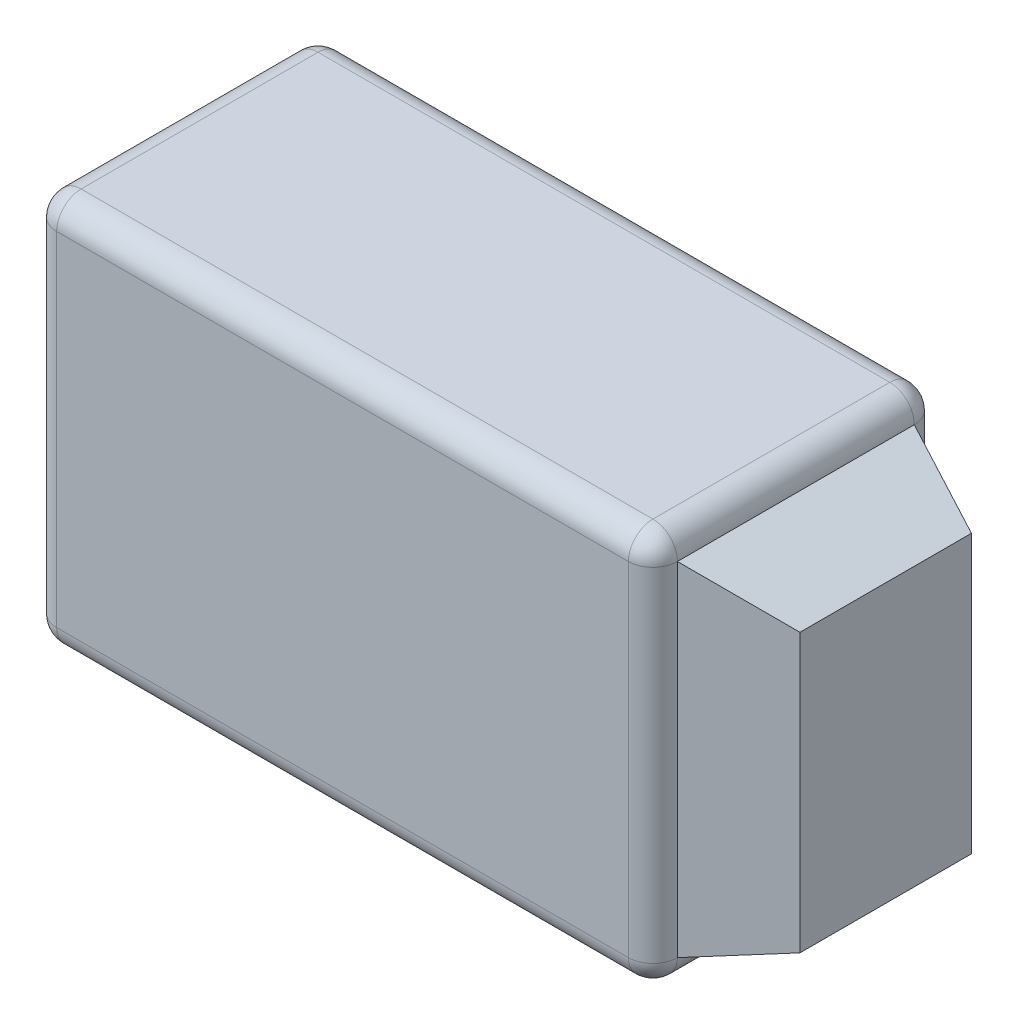
ISO-10303-21;
HEADER;
FILE_DESCRIPTION(('STEP AP214'),'2;1');
FILE_NAME('part.step','',(''),(''),'','','');
FILE_SCHEMA(('AUTOMOTIVE_DESIGN { 1 0 10303 214 1 1 1 1 }'));
ENDSEC;
DATA;
#1=APPLICATION_CONTEXT('core data for automotive mechanical design processes');
#2=APPLICATION_PROTOCOL_DEFINITION('international standard','automotive_design',2000,#1);
#3=PRODUCT_CONTEXT('',#1,'mechanical');
#4=PRODUCT('Part','Part','',(#3));
#5=PRODUCT_RELATED_PRODUCT_CATEGORY('part','',(#4));
#6=PRODUCT_DEFINITION_FORMATION('','',#4);
#7=PRODUCT_DEFINITION_CONTEXT('part definition',#1,'design');
#8=PRODUCT_DEFINITION('design','',#6,#7);
#9=PRODUCT_DEFINITION_SHAPE('','',#8);
#10=(LENGTH_UNIT() NAMED_UNIT(*) SI_UNIT(.MILLI.,.METRE.));
#11=(NAMED_UNIT(*) PLANE_ANGLE_UNIT() SI_UNIT($,.RADIAN.));
#12=(NAMED_UNIT(*) SI_UNIT($,.STERADIAN.) SOLID_ANGLE_UNIT());
#13=UNCERTAINTY_MEASURE_WITH_UNIT(LENGTH_MEASURE(1.E-05),#10,'distance_accuracy_value','');
#14=(GEOMETRIC_REPRESENTATION_CONTEXT(3) GLOBAL_UNCERTAINTY_ASSIGNED_CONTEXT((#13)) GLOBAL_UNIT_ASSIGNED_CONTEXT((#10,
#11,#12)) REPRESENTATION_CONTEXT('',''));
#15=CARTESIAN_POINT('',(0.,0.,0.));
#16=DIRECTION('',(0.,0.,1.));
#17=DIRECTION('',(1.,0.,0.));
#18=AXIS2_PLACEMENT_3D('',#15,#16,#17);
#19=CARTESIAN_POINT('',(-38.,48.,17.5));
#20=DIRECTION('',(1.,0.,0.));
#21=DIRECTION('',(0.,0.,-1.));
#22=AXIS2_PLACEMENT_3D('',#19,#20,#21);
#23=PLANE('',#22);
#24=DIRECTION('',(0.,0.,1.));
#25=VECTOR('',#24,1.);
#26=CARTESIAN_POINT('',(-38.,45.,-17.5));
#27=LINE('',#26,#25);
#28=CARTESIAN_POINT('',(-38.,45.,14.5));
#29=VERTEX_POINT('',#28);
#30=CARTESIAN_POINT('',(-38.,45.,-14.5));
#31=VERTEX_POINT('',#30);
#32=EDGE_CURVE('E186',#29,#31,#27,.F.);
#33=ORIENTED_EDGE('',*,*,#32,.T.);
#34=DIRECTION('',(0.,-1.,0.));
#35=VECTOR('',#34,1.);
#36=CARTESIAN_POINT('',(-38.,48.,-14.5));
#37=LINE('',#36,#35);
#38=CARTESIAN_POINT('',(-38.,3.,-14.5));
#39=VERTEX_POINT('',#38);
#40=EDGE_CURVE('E198',#31,#39,#37,.T.);
#41=ORIENTED_EDGE('',*,*,#40,.T.);
#42=DIRECTION('',(0.,0.,1.));
#43=VECTOR('',#42,1.);
#44=CARTESIAN_POINT('',(-38.,3.,17.5));
#45=LINE('',#44,#43);
#46=CARTESIAN_POINT('',(-38.,3.,14.5));
#47=VERTEX_POINT('',#46);
#48=EDGE_CURVE('E196',#39,#47,#45,.T.);
#49=ORIENTED_EDGE('',*,*,#48,.T.);
#50=DIRECTION('',(0.,-1.,0.));
#51=VECTOR('',#50,1.);
#52=CARTESIAN_POINT('',(-38.,48.,14.5));
#53=LINE('',#52,#51);
#54=EDGE_CURVE('E189',#47,#29,#53,.F.);
#55=ORIENTED_EDGE('',*,*,#54,.T.);
#56=EDGE_LOOP('',(#33,#41,#49,#55));
#57=FACE_BOUND('',#56,.T.);
#58=ADVANCED_FACE('F36',(#57),#23,.F.);
#59=CARTESIAN_POINT('',(38.,48.,17.5));
#60=DIRECTION('',(0.,0.,-1.));
#61=DIRECTION('',(-1.,0.,0.));
#62=AXIS2_PLACEMENT_3D('',#59,#60,#61);
#63=PLANE('',#62);
#64=DIRECTION('',(0.,-1.,0.));
#65=VECTOR('',#64,1.);
#66=CARTESIAN_POINT('',(-35.,48.,17.5));
#67=LINE('',#66,#65);
#68=CARTESIAN_POINT('',(-35.,45.,17.5));
#69=VERTEX_POINT('',#68);
#70=CARTESIAN_POINT('',(-35.,3.,17.5));
#71=VERTEX_POINT('',#70);
#72=EDGE_CURVE('E214',#69,#71,#67,.T.);
#73=ORIENTED_EDGE('',*,*,#72,.T.);
#74=DIRECTION('',(1.,0.,0.));
#75=VECTOR('',#74,1.);
#76=CARTESIAN_POINT('',(38.,3.,17.5));
#77=LINE('',#76,#75);
#78=CARTESIAN_POINT('',(35.,3.,17.5));
#79=VERTEX_POINT('',#78);
#80=EDGE_CURVE('E217',#71,#79,#77,.T.);
#81=ORIENTED_EDGE('',*,*,#80,.T.);
#82=DIRECTION('',(0.,-1.,0.));
#83=VECTOR('',#82,1.);
#84=CARTESIAN_POINT('',(35.,48.,17.5));
#85=LINE('',#84,#83);
#86=CARTESIAN_POINT('',(35.,45.,17.5));
#87=VERTEX_POINT('',#86);
#88=EDGE_CURVE('E212',#79,#87,#85,.F.);
#89=ORIENTED_EDGE('',*,*,#88,.T.);
#90=DIRECTION('',(1.,0.,0.));
#91=VECTOR('',#90,1.);
#92=CARTESIAN_POINT('',(-38.,45.,17.5));
#93=LINE('',#92,#91);
#94=EDGE_CURVE('E210',#87,#69,#93,.F.);
#95=ORIENTED_EDGE('',*,*,#94,.T.);
#96=EDGE_LOOP('',(#73,#81,#89,#95));
#97=FACE_BOUND('',#96,.T.);
#98=ADVANCED_FACE('F323',(#97),#63,.F.);
#99=CARTESIAN_POINT('',(38.,48.,-17.5));
#100=DIRECTION('',(0.,0.,1.));
#101=DIRECTION('',(1.,0.,0.));
#102=AXIS2_PLACEMENT_3D('',#99,#100,#101);
#103=PLANE('',#102);
#104=DIRECTION('',(0.,-1.,0.));
#105=VECTOR('',#104,1.);
#106=CARTESIAN_POINT('',(35.,48.,-17.5));
#107=LINE('',#106,#105);
#108=CARTESIAN_POINT('',(35.,45.,-17.5));
#109=VERTEX_POINT('',#108);
#110=CARTESIAN_POINT('',(35.,3.,-17.5));
#111=VERTEX_POINT('',#110);
#112=EDGE_CURVE('E169',#109,#111,#107,.T.);
#113=ORIENTED_EDGE('',*,*,#112,.T.);
#114=DIRECTION('',(-1.,0.,0.));
#115=VECTOR('',#114,1.);
#116=CARTESIAN_POINT('',(38.,3.,-17.5));
#117=LINE('',#116,#115);
#118=CARTESIAN_POINT('',(-35.,3.,-17.5));
#119=VERTEX_POINT('',#118);
#120=EDGE_CURVE('E150',#111,#119,#117,.T.);
#121=ORIENTED_EDGE('',*,*,#120,.T.);
#122=DIRECTION('',(0.,-1.,0.));
#123=VECTOR('',#122,1.);
#124=CARTESIAN_POINT('',(-35.,48.,-17.5));
#125=LINE('',#124,#123);
#126=CARTESIAN_POINT('',(-35.,45.,-17.5));
#127=VERTEX_POINT('',#126);
#128=EDGE_CURVE('E283',#119,#127,#125,.F.);
#129=ORIENTED_EDGE('',*,*,#128,.T.);
#130=DIRECTION('',(-1.,0.,0.));
#131=VECTOR('',#130,1.);
#132=CARTESIAN_POINT('',(38.,45.,-17.5));
#133=LINE('',#132,#131);
#134=EDGE_CURVE('E278',#127,#109,#133,.F.);
#135=ORIENTED_EDGE('',*,*,#134,.T.);
#136=EDGE_LOOP('',(#113,#121,#129,#135));
#137=FACE_BOUND('',#136,.T.);
#138=ADVANCED_FACE('F329',(#137),#103,.F.);
#139=CARTESIAN_POINT('',(0.,48.,0.));
#140=DIRECTION('',(0.,1.,0.));
#141=DIRECTION('',(0.,0.,1.));
#142=AXIS2_PLACEMENT_3D('',#139,#140,#141);
#143=PLANE('',#142);
#144=DIRECTION('',(0.,0.,-1.));
#145=VECTOR('',#144,1.);
#146=CARTESIAN_POINT('',(35.,48.,-17.5));
#147=LINE('',#146,#145);
#148=CARTESIAN_POINT('',(35.,48.,14.5));
#149=VERTEX_POINT('',#148);
#150=CARTESIAN_POINT('',(35.,48.,-14.5));
#151=VERTEX_POINT('',#150);
#152=EDGE_CURVE('E45',#149,#151,#147,.T.);
#153=ORIENTED_EDGE('',*,*,#152,.T.);
#154=DIRECTION('',(-1.,0.,0.));
#155=VECTOR('',#154,1.);
#156=CARTESIAN_POINT('',(-38.,48.,-14.5));
#157=LINE('',#156,#155);
#158=CARTESIAN_POINT('',(-35.,48.,-14.5));
#159=VERTEX_POINT('',#158);
#160=EDGE_CURVE('E11',#151,#159,#157,.T.);
#161=ORIENTED_EDGE('',*,*,#160,.T.);
#162=DIRECTION('',(0.,0.,1.));
#163=VECTOR('',#162,1.);
#164=CARTESIAN_POINT('',(-35.,48.,17.5));
#165=LINE('',#164,#163);
#166=CARTESIAN_POINT('',(-35.,48.,14.5));
#167=VERTEX_POINT('',#166);
#168=EDGE_CURVE('E219',#159,#167,#165,.T.);
#169=ORIENTED_EDGE('',*,*,#168,.T.);
#170=DIRECTION('',(1.,0.,0.));
#171=VECTOR('',#170,1.);
#172=CARTESIAN_POINT('',(38.,48.,14.5));
#173=LINE('',#172,#171);
#174=EDGE_CURVE('E56',#167,#149,#173,.T.);
#175=ORIENTED_EDGE('',*,*,#174,.T.);
#176=EDGE_LOOP('',(#153,#161,#169,#175));
#177=FACE_BOUND('',#176,.T.);
#178=ADVANCED_FACE('F428',(#177),#143,.T.);
#179=CARTESIAN_POINT('',(0.,0.,0.));
#180=DIRECTION('',(0.,1.,0.));
#181=DIRECTION('',(0.,0.,1.));
#182=AXIS2_PLACEMENT_3D('',#179,#180,#181);
#183=PLANE('',#182);
#184=DIRECTION('',(-1.,0.,0.));
#185=VECTOR('',#184,1.);
#186=CARTESIAN_POINT('',(0.,0.,-14.5));
#187=LINE('',#186,#185);
#188=CARTESIAN_POINT('',(-35.,0.,-14.5));
#189=VERTEX_POINT('',#188);
#190=CARTESIAN_POINT('',(35.,0.,-14.5));
#191=VERTEX_POINT('',#190);
#192=EDGE_CURVE('E205',#189,#191,#187,.F.);
#193=ORIENTED_EDGE('',*,*,#192,.T.);
#194=DIRECTION('',(0.,0.,-1.));
#195=VECTOR('',#194,1.);
#196=CARTESIAN_POINT('',(35.,0.,0.));
#197=LINE('',#196,#195);
#198=CARTESIAN_POINT('',(35.,0.,14.5));
#199=VERTEX_POINT('',#198);
#200=EDGE_CURVE('E207',#191,#199,#197,.F.);
#201=ORIENTED_EDGE('',*,*,#200,.T.);
#202=DIRECTION('',(1.,0.,0.));
#203=VECTOR('',#202,1.);
#204=CARTESIAN_POINT('',(0.,0.,14.5));
#205=LINE('',#204,#203);
#206=CARTESIAN_POINT('',(-35.,0.,14.5));
#207=VERTEX_POINT('',#206);
#208=EDGE_CURVE('E201',#199,#207,#205,.F.);
#209=ORIENTED_EDGE('',*,*,#208,.T.);
#210=DIRECTION('',(0.,0.,1.));
#211=VECTOR('',#210,1.);
#212=CARTESIAN_POINT('',(-35.,0.,0.));
#213=LINE('',#212,#211);
#214=EDGE_CURVE('E203',#207,#189,#213,.F.);
#215=ORIENTED_EDGE('',*,*,#214,.T.);
#216=EDGE_LOOP('',(#193,#201,#209,#215));
#217=FACE_BOUND('',#216,.T.);
#218=ADVANCED_FACE('F402',(#217),#183,.F.);
#219=CARTESIAN_POINT('',(-35.,48.,14.5));
#220=DIRECTION('',(0.,-1.,0.));
#221=DIRECTION('',(0.,0.,-1.));
#222=AXIS2_PLACEMENT_3D('',#219,#220,#221);
#223=CYLINDRICAL_SURFACE('',#222,3.);
#224=CARTESIAN_POINT('',(-35.,45.,14.5));
#225=DIRECTION('',(0.,1.,0.));
#226=DIRECTION('',(0.,0.,1.));
#227=AXIS2_PLACEMENT_3D('',#224,#225,#226);
#228=CIRCLE('',#227,3.);
#229=EDGE_CURVE('E40',#29,#69,#228,.T.);
#230=ORIENTED_EDGE('',*,*,#229,.F.);
#231=ORIENTED_EDGE('',*,*,#54,.F.);
#232=CARTESIAN_POINT('',(-35.,3.,14.5));
#233=DIRECTION('',(0.,-1.,0.));
#234=DIRECTION('',(0.,0.,-1.));
#235=AXIS2_PLACEMENT_3D('',#232,#233,#234);
#236=CIRCLE('',#235,3.);
#237=EDGE_CURVE('E271',#71,#47,#236,.T.);
#238=ORIENTED_EDGE('',*,*,#237,.F.);
#239=ORIENTED_EDGE('',*,*,#72,.F.);
#240=EDGE_LOOP('',(#230,#231,#238,#239));
#241=FACE_BOUND('',#240,.T.);
#242=ADVANCED_FACE('F38',(#241),#223,.T.);
#243=CARTESIAN_POINT('',(-35.,45.,14.5));
#244=DIRECTION('',(0.,0.,1.));
#245=DIRECTION('',(1.,0.,0.));
#246=AXIS2_PLACEMENT_3D('',#243,#244,#245);
#247=SPHERICAL_SURFACE('',#246,3.);
#248=CARTESIAN_POINT('',(-35.,45.,14.5));
#249=DIRECTION('',(0.,0.,1.));
#250=DIRECTION('',(1.,0.,0.));
#251=AXIS2_PLACEMENT_3D('',#248,#249,#250);
#252=CIRCLE('',#251,3.);
#253=EDGE_CURVE('E266',#29,#167,#252,.F.);
#254=ORIENTED_EDGE('',*,*,#253,.F.);
#255=ORIENTED_EDGE('',*,*,#229,.T.);
#256=CARTESIAN_POINT('',(-35.,45.,14.5));
#257=DIRECTION('',(-1.,0.,0.));
#258=DIRECTION('',(0.,0.,1.));
#259=AXIS2_PLACEMENT_3D('',#256,#257,#258);
#260=CIRCLE('',#259,3.);
#261=EDGE_CURVE('E269',#167,#69,#260,.F.);
#262=ORIENTED_EDGE('',*,*,#261,.F.);
#263=EDGE_LOOP('',(#254,#255,#262));
#264=FACE_BOUND('',#263,.T.);
#265=ADVANCED_FACE('F397',(#264),#247,.T.);
#266=CARTESIAN_POINT('',(-35.,3.,14.5));
#267=DIRECTION('',(-1.,0.,0.));
#268=DIRECTION('',(0.,-1.,0.));
#269=AXIS2_PLACEMENT_3D('',#266,#267,#268);
#270=SPHERICAL_SURFACE('',#269,3.);
#271=CARTESIAN_POINT('',(-35.,3.,14.5));
#272=DIRECTION('',(-1.,0.,0.));
#273=DIRECTION('',(0.,0.,1.));
#274=AXIS2_PLACEMENT_3D('',#271,#272,#273);
#275=CIRCLE('',#274,3.);
#276=EDGE_CURVE('E260',#71,#207,#275,.F.);
#277=ORIENTED_EDGE('',*,*,#276,.F.);
#278=ORIENTED_EDGE('',*,*,#237,.T.);
#279=CARTESIAN_POINT('',(-35.,3.,14.5));
#280=DIRECTION('',(0.,0.,1.));
#281=DIRECTION('',(1.,0.,0.));
#282=AXIS2_PLACEMENT_3D('',#279,#280,#281);
#283=CIRCLE('',#282,3.);
#284=EDGE_CURVE('E263',#207,#47,#283,.F.);
#285=ORIENTED_EDGE('',*,*,#284,.F.);
#286=EDGE_LOOP('',(#277,#278,#285));
#287=FACE_BOUND('',#286,.T.);
#288=ADVANCED_FACE('F394',(#287),#270,.T.);
#289=CARTESIAN_POINT('',(0.,45.,14.5));
#290=DIRECTION('',(-1.,0.,0.));
#291=DIRECTION('',(0.,0.,1.));
#292=AXIS2_PLACEMENT_3D('',#289,#290,#291);
#293=CYLINDRICAL_SURFACE('',#292,3.);
#294=ORIENTED_EDGE('',*,*,#261,.T.);
#295=ORIENTED_EDGE('',*,*,#94,.F.);
#296=CARTESIAN_POINT('',(35.,45.,14.5));
#297=DIRECTION('',(1.,0.,0.));
#298=DIRECTION('',(0.,0.,-1.));
#299=AXIS2_PLACEMENT_3D('',#296,#297,#298);
#300=CIRCLE('',#299,3.);
#301=EDGE_CURVE('E254',#149,#87,#300,.T.);
#302=ORIENTED_EDGE('',*,*,#301,.F.);
#303=ORIENTED_EDGE('',*,*,#174,.F.);
#304=EDGE_LOOP('',(#294,#295,#302,#303));
#305=FACE_BOUND('',#304,.T.);
#306=ADVANCED_FACE('F390',(#305),#293,.T.);
#307=CARTESIAN_POINT('',(-35.,45.,0.));
#308=DIRECTION('',(0.,0.,-1.));
#309=DIRECTION('',(-1.,0.,0.));
#310=AXIS2_PLACEMENT_3D('',#307,#308,#309);
#311=CYLINDRICAL_SURFACE('',#310,3.);
#312=ORIENTED_EDGE('',*,*,#253,.T.);
#313=ORIENTED_EDGE('',*,*,#168,.F.);
#314=CARTESIAN_POINT('',(-35.,45.,-14.5));
#315=DIRECTION('',(0.,0.,-1.));
#316=DIRECTION('',(-1.,0.,0.));
#317=AXIS2_PLACEMENT_3D('',#314,#315,#316);
#318=CIRCLE('',#317,3.);
#319=EDGE_CURVE('E251',#31,#159,#318,.T.);
#320=ORIENTED_EDGE('',*,*,#319,.F.);
#321=ORIENTED_EDGE('',*,*,#32,.F.);
#322=EDGE_LOOP('',(#312,#313,#320,#321));
#323=FACE_BOUND('',#322,.T.);
#324=ADVANCED_FACE('F386',(#323),#311,.T.);
#325=CARTESIAN_POINT('',(-35.,48.,-14.5));
#326=DIRECTION('',(0.,-1.,0.));
#327=DIRECTION('',(0.,0.,-1.));
#328=AXIS2_PLACEMENT_3D('',#325,#326,#327);
#329=CYLINDRICAL_SURFACE('',#328,3.);
#330=CARTESIAN_POINT('',(-35.,3.,-14.5));
#331=DIRECTION('',(0.,-1.,0.));
#332=DIRECTION('',(0.,0.,-1.));
#333=AXIS2_PLACEMENT_3D('',#330,#331,#332);
#334=CIRCLE('',#333,3.);
#335=EDGE_CURVE('E245',#39,#119,#334,.T.);
#336=ORIENTED_EDGE('',*,*,#335,.F.);
#337=ORIENTED_EDGE('',*,*,#40,.F.);
#338=CARTESIAN_POINT('',(-35.,45.,-14.5));
#339=DIRECTION('',(0.,1.,0.));
#340=DIRECTION('',(0.,0.,1.));
#341=AXIS2_PLACEMENT_3D('',#338,#339,#340);
#342=CIRCLE('',#341,3.);
#343=EDGE_CURVE('E248',#127,#31,#342,.T.);
#344=ORIENTED_EDGE('',*,*,#343,.F.);
#345=ORIENTED_EDGE('',*,*,#128,.F.);
#346=EDGE_LOOP('',(#336,#337,#344,#345));
#347=FACE_BOUND('',#346,.T.);
#348=ADVANCED_FACE('F382',(#347),#329,.T.);
#349=CARTESIAN_POINT('',(-35.,3.,17.5));
#350=DIRECTION('',(0.,0.,1.));
#351=DIRECTION('',(1.,0.,0.));
#352=AXIS2_PLACEMENT_3D('',#349,#350,#351);
#353=CYLINDRICAL_SURFACE('',#352,3.);
#354=ORIENTED_EDGE('',*,*,#284,.T.);
#355=ORIENTED_EDGE('',*,*,#48,.F.);
#356=CARTESIAN_POINT('',(-35.,3.,-14.5));
#357=DIRECTION('',(0.,0.,-1.));
#358=DIRECTION('',(-1.,0.,0.));
#359=AXIS2_PLACEMENT_3D('',#356,#357,#358);
#360=CIRCLE('',#359,3.);
#361=EDGE_CURVE('E243',#189,#39,#360,.T.);
#362=ORIENTED_EDGE('',*,*,#361,.F.);
#363=ORIENTED_EDGE('',*,*,#214,.F.);
#364=EDGE_LOOP('',(#354,#355,#362,#363));
#365=FACE_BOUND('',#364,.T.);
#366=ADVANCED_FACE('F378',(#365),#353,.T.);
#367=CARTESIAN_POINT('',(38.,3.,14.5));
#368=DIRECTION('',(1.,0.,0.));
#369=DIRECTION('',(0.,0.,-1.));
#370=AXIS2_PLACEMENT_3D('',#367,#368,#369);
#371=CYLINDRICAL_SURFACE('',#370,3.);
#372=ORIENTED_EDGE('',*,*,#276,.T.);
#373=ORIENTED_EDGE('',*,*,#208,.F.);
#374=CARTESIAN_POINT('',(35.,3.,14.5));
#375=DIRECTION('',(1.,0.,0.));
#376=DIRECTION('',(0.,0.,-1.));
#377=AXIS2_PLACEMENT_3D('',#374,#375,#376);
#378=CIRCLE('',#377,3.);
#379=EDGE_CURVE('E240',#79,#199,#378,.T.);
#380=ORIENTED_EDGE('',*,*,#379,.F.);
#381=ORIENTED_EDGE('',*,*,#80,.F.);
#382=EDGE_LOOP('',(#372,#373,#380,#381));
#383=FACE_BOUND('',#382,.T.);
#384=ADVANCED_FACE('F375',(#383),#371,.T.);
#385=CARTESIAN_POINT('',(35.,48.,14.5));
#386=DIRECTION('',(0.,-1.,0.));
#387=DIRECTION('',(0.,0.,-1.));
#388=AXIS2_PLACEMENT_3D('',#385,#386,#387);
#389=CYLINDRICAL_SURFACE('',#388,3.);
#390=CARTESIAN_POINT('',(35.,45.,14.5));
#391=DIRECTION('',(0.,1.,0.));
#392=DIRECTION('',(0.,0.,1.));
#393=AXIS2_PLACEMENT_3D('',#390,#391,#392);
#394=CIRCLE('',#393,3.);
#395=CARTESIAN_POINT('',(38.,45.,14.5));
#396=VERTEX_POINT('',#395);
#397=EDGE_CURVE('E257',#87,#396,#394,.T.);
#398=ORIENTED_EDGE('',*,*,#397,.F.);
#399=ORIENTED_EDGE('',*,*,#88,.F.);
#400=CARTESIAN_POINT('',(35.,3.,14.5));
#401=DIRECTION('',(0.,-1.,0.));
#402=DIRECTION('',(0.,0.,-1.));
#403=AXIS2_PLACEMENT_3D('',#400,#401,#402);
#404=CIRCLE('',#403,3.);
#405=CARTESIAN_POINT('',(38.,3.,14.5));
#406=VERTEX_POINT('',#405);
#407=EDGE_CURVE('E237',#406,#79,#404,.T.);
#408=ORIENTED_EDGE('',*,*,#407,.F.);
#409=DIRECTION('',(0.,-1.,0.));
#410=VECTOR('',#409,1.);
#411=CARTESIAN_POINT('',(38.,48.,14.5));
#412=LINE('',#411,#410);
#413=EDGE_CURVE('E149',#396,#406,#412,.T.);
#414=ORIENTED_EDGE('',*,*,#413,.F.);
#415=EDGE_LOOP('',(#398,#399,#408,#414));
#416=FACE_BOUND('',#415,.T.);
#417=ADVANCED_FACE('F371',(#416),#389,.T.);
#418=CARTESIAN_POINT('',(35.,45.,14.5));
#419=DIRECTION('',(0.,0.,1.));
#420=DIRECTION('',(1.,0.,0.));
#421=AXIS2_PLACEMENT_3D('',#418,#419,#420);
#422=SPHERICAL_SURFACE('',#421,3.);
#423=ORIENTED_EDGE('',*,*,#301,.T.);
#424=ORIENTED_EDGE('',*,*,#397,.T.);
#425=CARTESIAN_POINT('',(35.,45.,14.5));
#426=DIRECTION('',(0.,0.,1.));
#427=DIRECTION('',(1.,0.,0.));
#428=AXIS2_PLACEMENT_3D('',#425,#426,#427);
#429=CIRCLE('',#428,3.);
#430=EDGE_CURVE('E144',#149,#396,#429,.F.);
#431=ORIENTED_EDGE('',*,*,#430,.F.);
#432=EDGE_LOOP('',(#423,#424,#431));
#433=FACE_BOUND('',#432,.T.);
#434=ADVANCED_FACE('F367',(#433),#422,.T.);
#435=CARTESIAN_POINT('',(-35.,45.,-14.5));
#436=DIRECTION('',(-1.,0.,0.));
#437=DIRECTION('',(0.,0.,1.));
#438=AXIS2_PLACEMENT_3D('',#435,#436,#437);
#439=SPHERICAL_SURFACE('',#438,3.);
#440=ORIENTED_EDGE('',*,*,#343,.T.);
#441=ORIENTED_EDGE('',*,*,#319,.T.);
#442=CARTESIAN_POINT('',(-35.,45.,-14.5));
#443=DIRECTION('',(-1.,0.,0.));
#444=DIRECTION('',(0.,0.,1.));
#445=AXIS2_PLACEMENT_3D('',#442,#443,#444);
#446=CIRCLE('',#445,3.);
#447=EDGE_CURVE('E234',#127,#159,#446,.F.);
#448=ORIENTED_EDGE('',*,*,#447,.F.);
#449=EDGE_LOOP('',(#440,#441,#448));
#450=FACE_BOUND('',#449,.T.);
#451=ADVANCED_FACE('F363',(#450),#439,.T.);
#452=CARTESIAN_POINT('',(-35.,3.,-14.5));
#453=DIRECTION('',(-1.,0.,0.));
#454=DIRECTION('',(0.,-1.,0.));
#455=AXIS2_PLACEMENT_3D('',#452,#453,#454);
#456=SPHERICAL_SURFACE('',#455,3.);
#457=ORIENTED_EDGE('',*,*,#361,.T.);
#458=ORIENTED_EDGE('',*,*,#335,.T.);
#459=CARTESIAN_POINT('',(-35.,3.,-14.5));
#460=DIRECTION('',(-1.,0.,0.));
#461=DIRECTION('',(0.,0.,1.));
#462=AXIS2_PLACEMENT_3D('',#459,#460,#461);
#463=CIRCLE('',#462,3.);
#464=EDGE_CURVE('E231',#189,#119,#463,.F.);
#465=ORIENTED_EDGE('',*,*,#464,.F.);
#466=EDGE_LOOP('',(#457,#458,#465));
#467=FACE_BOUND('',#466,.T.);
#468=ADVANCED_FACE('F359',(#467),#456,.T.);
#469=CARTESIAN_POINT('',(35.,3.,14.5));
#470=DIRECTION('',(0.,0.,1.));
#471=DIRECTION('',(0.,-1.,0.));
#472=AXIS2_PLACEMENT_3D('',#469,#470,#471);
#473=SPHERICAL_SURFACE('',#472,3.);
#474=ORIENTED_EDGE('',*,*,#407,.T.);
#475=ORIENTED_EDGE('',*,*,#379,.T.);
#476=CARTESIAN_POINT('',(35.,3.,14.5));
#477=DIRECTION('',(0.,0.,1.));
#478=DIRECTION('',(1.,0.,0.));
#479=AXIS2_PLACEMENT_3D('',#476,#477,#478);
#480=CIRCLE('',#479,3.);
#481=EDGE_CURVE('E160',#406,#199,#480,.F.);
#482=ORIENTED_EDGE('',*,*,#481,.F.);
#483=EDGE_LOOP('',(#474,#475,#482));
#484=FACE_BOUND('',#483,.T.);
#485=ADVANCED_FACE('F356',(#484),#473,.T.);
#486=CARTESIAN_POINT('',(35.,45.,0.));
#487=DIRECTION('',(0.,0.,1.));
#488=DIRECTION('',(1.,0.,0.));
#489=AXIS2_PLACEMENT_3D('',#486,#487,#488);
#490=CYLINDRICAL_SURFACE('',#489,3.);
#491=ORIENTED_EDGE('',*,*,#430,.T.);
#492=DIRECTION('',(0.,0.,-1.));
#493=VECTOR('',#492,1.);
#494=CARTESIAN_POINT('',(38.,45.,17.5));
#495=LINE('',#494,#493);
#496=CARTESIAN_POINT('',(38.,45.,-14.5));
#497=VERTEX_POINT('',#496);
#498=EDGE_CURVE('E138',#497,#396,#495,.F.);
#499=ORIENTED_EDGE('',*,*,#498,.F.);
#500=CARTESIAN_POINT('',(35.,45.,-14.5));
#501=DIRECTION('',(0.,0.,-1.));
#502=DIRECTION('',(-1.,0.,0.));
#503=AXIS2_PLACEMENT_3D('',#500,#501,#502);
#504=CIRCLE('',#503,3.);
#505=EDGE_CURVE('E141',#151,#497,#504,.T.);
#506=ORIENTED_EDGE('',*,*,#505,.F.);
#507=ORIENTED_EDGE('',*,*,#152,.F.);
#508=EDGE_LOOP('',(#491,#499,#506,#507));
#509=FACE_BOUND('',#508,.T.);
#510=ADVANCED_FACE('F140',(#509),#490,.T.);
#511=CARTESIAN_POINT('',(0.,45.,-14.5));
#512=DIRECTION('',(1.,0.,0.));
#513=DIRECTION('',(0.,0.,-1.));
#514=AXIS2_PLACEMENT_3D('',#511,#512,#513);
#515=CYLINDRICAL_SURFACE('',#514,3.);
#516=ORIENTED_EDGE('',*,*,#447,.T.);
#517=ORIENTED_EDGE('',*,*,#160,.F.);
#518=CARTESIAN_POINT('',(35.,45.,-14.5));
#519=DIRECTION('',(1.,0.,0.));
#520=DIRECTION('',(0.,0.,-1.));
#521=AXIS2_PLACEMENT_3D('',#518,#519,#520);
#522=CIRCLE('',#521,3.);
#523=EDGE_CURVE('E159',#109,#151,#522,.T.);
#524=ORIENTED_EDGE('',*,*,#523,.F.);
#525=ORIENTED_EDGE('',*,*,#134,.F.);
#526=EDGE_LOOP('',(#516,#517,#524,#525));
#527=FACE_BOUND('',#526,.T.);
#528=ADVANCED_FACE('F349',(#527),#515,.T.);
#529=CARTESIAN_POINT('',(38.,3.,-14.5));
#530=DIRECTION('',(-1.,0.,0.));
#531=DIRECTION('',(0.,0.,1.));
#532=AXIS2_PLACEMENT_3D('',#529,#530,#531);
#533=CYLINDRICAL_SURFACE('',#532,3.);
#534=ORIENTED_EDGE('',*,*,#464,.T.);
#535=ORIENTED_EDGE('',*,*,#120,.F.);
#536=CARTESIAN_POINT('',(35.,3.,-14.5));
#537=DIRECTION('',(1.,0.,0.));
#538=DIRECTION('',(0.,0.,-1.));
#539=AXIS2_PLACEMENT_3D('',#536,#537,#538);
#540=CIRCLE('',#539,3.);
#541=EDGE_CURVE('E226',#191,#111,#540,.T.);
#542=ORIENTED_EDGE('',*,*,#541,.F.);
#543=ORIENTED_EDGE('',*,*,#192,.F.);
#544=EDGE_LOOP('',(#534,#535,#542,#543));
#545=FACE_BOUND('',#544,.T.);
#546=ADVANCED_FACE('F345',(#545),#533,.T.);
#547=CARTESIAN_POINT('',(35.,3.,17.5));
#548=DIRECTION('',(0.,0.,-1.));
#549=DIRECTION('',(-1.,0.,0.));
#550=AXIS2_PLACEMENT_3D('',#547,#548,#549);
#551=CYLINDRICAL_SURFACE('',#550,3.);
#552=ORIENTED_EDGE('',*,*,#481,.T.);
#553=ORIENTED_EDGE('',*,*,#200,.F.);
#554=CARTESIAN_POINT('',(35.,3.,-14.5));
#555=DIRECTION('',(0.,0.,-1.));
#556=DIRECTION('',(-1.,0.,0.));
#557=AXIS2_PLACEMENT_3D('',#554,#555,#556);
#558=CIRCLE('',#557,3.);
#559=CARTESIAN_POINT('',(38.,3.,-14.5));
#560=VERTEX_POINT('',#559);
#561=EDGE_CURVE('E170',#560,#191,#558,.T.);
#562=ORIENTED_EDGE('',*,*,#561,.F.);
#563=DIRECTION('',(0.,0.,-1.));
#564=VECTOR('',#563,1.);
#565=CARTESIAN_POINT('',(38.,3.,17.5));
#566=LINE('',#565,#564);
#567=EDGE_CURVE('E187',#406,#560,#566,.T.);
#568=ORIENTED_EDGE('',*,*,#567,.F.);
#569=EDGE_LOOP('',(#552,#553,#562,#568));
#570=FACE_BOUND('',#569,.T.);
#571=ADVANCED_FACE('F342',(#570),#551,.T.);
#572=CARTESIAN_POINT('',(35.,45.,-14.5));
#573=DIRECTION('',(0.,1.,0.));
#574=DIRECTION('',(0.,0.,1.));
#575=AXIS2_PLACEMENT_3D('',#572,#573,#574);
#576=SPHERICAL_SURFACE('',#575,3.);
#577=ORIENTED_EDGE('',*,*,#523,.T.);
#578=ORIENTED_EDGE('',*,*,#505,.T.);
#579=CARTESIAN_POINT('',(35.,45.,-14.5));
#580=DIRECTION('',(0.,1.,0.));
#581=DIRECTION('',(0.,0.,1.));
#582=AXIS2_PLACEMENT_3D('',#579,#580,#581);
#583=CIRCLE('',#582,3.);
#584=EDGE_CURVE('E156',#109,#497,#583,.F.);
#585=ORIENTED_EDGE('',*,*,#584,.F.);
#586=EDGE_LOOP('',(#577,#578,#585));
#587=FACE_BOUND('',#586,.T.);
#588=ADVANCED_FACE('F155',(#587),#576,.T.);
#589=CARTESIAN_POINT('',(35.,3.,-14.5));
#590=DIRECTION('',(0.,-1.,0.));
#591=DIRECTION('',(0.,0.,-1.));
#592=AXIS2_PLACEMENT_3D('',#589,#590,#591);
#593=SPHERICAL_SURFACE('',#592,3.);
#594=ORIENTED_EDGE('',*,*,#561,.T.);
#595=ORIENTED_EDGE('',*,*,#541,.T.);
#596=CARTESIAN_POINT('',(35.,3.,-14.5));
#597=DIRECTION('',(0.,-1.,0.));
#598=DIRECTION('',(0.,0.,-1.));
#599=AXIS2_PLACEMENT_3D('',#596,#597,#598);
#600=CIRCLE('',#599,3.);
#601=EDGE_CURVE('E171',#560,#111,#600,.F.);
#602=ORIENTED_EDGE('',*,*,#601,.F.);
#603=EDGE_LOOP('',(#594,#595,#602));
#604=FACE_BOUND('',#603,.T.);
#605=ADVANCED_FACE('F336',(#604),#593,.T.);
#606=CARTESIAN_POINT('',(35.,48.,-14.5));
#607=DIRECTION('',(0.,-1.,0.));
#608=DIRECTION('',(0.,0.,-1.));
#609=AXIS2_PLACEMENT_3D('',#606,#607,#608);
#610=CYLINDRICAL_SURFACE('',#609,3.);
#611=ORIENTED_EDGE('',*,*,#584,.T.);
#612=DIRECTION('',(0.,-1.,0.));
#613=VECTOR('',#612,1.);
#614=CARTESIAN_POINT('',(38.,48.,-14.5));
#615=LINE('',#614,#613);
#616=EDGE_CURVE('E166',#560,#497,#615,.F.);
#617=ORIENTED_EDGE('',*,*,#616,.F.);
#618=ORIENTED_EDGE('',*,*,#601,.T.);
#619=ORIENTED_EDGE('',*,*,#112,.F.);
#620=EDGE_LOOP('',(#611,#617,#618,#619));
#621=FACE_BOUND('',#620,.T.);
#622=ADVANCED_FACE('F164',(#621),#610,.T.);
#623=CARTESIAN_POINT('',(38.,45.,-14.5));
#624=DIRECTION('',(0.342020143325669,0.,-0.939692620785908));
#625=DIRECTION('',(-0.939692620785908,0.,-0.342020143325669));
#626=AXIS2_PLACEMENT_3D('',#623,#624,#625);
#627=PLANE('',#626);
#628=ORIENTED_EDGE('',*,*,#616,.T.);
#629=DIRECTION('',(-0.889126490715988,0.323615577118185,-0.323615577118185));
#630=VECTOR('',#629,1.);
#631=CARTESIAN_POINT('',(38.,45.,-14.5));
#632=LINE('',#631,#630);
#633=CARTESIAN_POINT('',(49.,40.9963274230718,-10.4963274230718));
#634=VERTEX_POINT('',#633);
#635=EDGE_CURVE('E174',#634,#497,#632,.T.);
#636=ORIENTED_EDGE('',*,*,#635,.F.);
#637=DIRECTION('',(0.,-1.,0.));
#638=VECTOR('',#637,1.);
#639=CARTESIAN_POINT('',(49.,0.,-10.4963274230718));
#640=LINE('',#639,#638);
#641=CARTESIAN_POINT('',(49.,7.00367257692824,-10.4963274230718));
#642=VERTEX_POINT('',#641);
#643=EDGE_CURVE('E310',#642,#634,#640,.F.);
#644=ORIENTED_EDGE('',*,*,#643,.F.);
#645=DIRECTION('',(-0.889126490715988,-0.323615577118185,-0.323615577118185));
#646=VECTOR('',#645,1.);
#647=CARTESIAN_POINT('',(50.0848776618131,7.39853575364852,-10.1014642463515));
#648=LINE('',#647,#646);
#649=EDGE_CURVE('E185',#642,#560,#648,.T.);
#650=ORIENTED_EDGE('',*,*,#649,.T.);
#651=EDGE_LOOP('',(#628,#636,#644,#650));
#652=FACE_BOUND('',#651,.T.);
#653=ADVANCED_FACE('F183',(#652),#627,.T.);
#654=CARTESIAN_POINT('',(38.,45.,-14.5));
#655=DIRECTION('',(0.342020143325669,0.939692620785908,0.));
#656=DIRECTION('',(-0.939692620785908,0.342020143325669,0.));
#657=AXIS2_PLACEMENT_3D('',#654,#655,#656);
#658=PLANE('',#657);
#659=ORIENTED_EDGE('',*,*,#498,.T.);
#660=DIRECTION('',(-0.889126490715988,0.323615577118185,0.323615577118185));
#661=VECTOR('',#660,1.);
#662=CARTESIAN_POINT('',(38.,45.,14.5));
#663=LINE('',#662,#661);
#664=CARTESIAN_POINT('',(49.,40.9963274230718,10.4963274230718));
#665=VERTEX_POINT('',#664);
#666=EDGE_CURVE('E180',#665,#396,#663,.T.);
#667=ORIENTED_EDGE('',*,*,#666,.F.);
#668=DIRECTION('',(0.,0.,-1.));
#669=VECTOR('',#668,1.);
#670=CARTESIAN_POINT('',(49.,40.9963274230718,0.));
#671=LINE('',#670,#669);
#672=EDGE_CURVE('E176',#634,#665,#671,.F.);
#673=ORIENTED_EDGE('',*,*,#672,.F.);
#674=ORIENTED_EDGE('',*,*,#635,.T.);
#675=EDGE_LOOP('',(#659,#667,#673,#674));
#676=FACE_BOUND('',#675,.T.);
#677=ADVANCED_FACE('F175',(#676),#658,.T.);
#678=CARTESIAN_POINT('',(38.,45.,14.5));
#679=DIRECTION('',(0.342020143325669,0.,0.939692620785908));
#680=DIRECTION('',(0.939692620785908,0.,-0.342020143325669));
#681=AXIS2_PLACEMENT_3D('',#678,#679,#680);
#682=PLANE('',#681);
#683=ORIENTED_EDGE('',*,*,#413,.T.);
#684=DIRECTION('',(-0.889126490715988,-0.323615577118185,0.323615577118185));
#685=VECTOR('',#684,1.);
#686=CARTESIAN_POINT('',(46.3443202902995,6.03708421085255,11.4629157891475));
#687=LINE('',#686,#685);
#688=CARTESIAN_POINT('',(49.,7.00367257692824,10.4963274230718));
#689=VERTEX_POINT('',#688);
#690=EDGE_CURVE('E299',#689,#406,#687,.T.);
#691=ORIENTED_EDGE('',*,*,#690,.F.);
#692=DIRECTION('',(0.,1.,0.));
#693=VECTOR('',#692,1.);
#694=CARTESIAN_POINT('',(49.,0.,10.4963274230718));
#695=LINE('',#694,#693);
#696=EDGE_CURVE('E312',#665,#689,#695,.F.);
#697=ORIENTED_EDGE('',*,*,#696,.F.);
#698=ORIENTED_EDGE('',*,*,#666,.T.);
#699=EDGE_LOOP('',(#683,#691,#697,#698));
#700=FACE_BOUND('',#699,.T.);
#701=ADVANCED_FACE('F297',(#700),#682,.T.);
#702=CARTESIAN_POINT('',(38.,3.,-14.5));
#703=DIRECTION('',(0.342020143325669,-0.939692620785908,0.));
#704=DIRECTION('',(0.939692620785908,0.342020143325669,0.));
#705=AXIS2_PLACEMENT_3D('',#702,#703,#704);
#706=PLANE('',#705);
#707=ORIENTED_EDGE('',*,*,#567,.T.);
#708=ORIENTED_EDGE('',*,*,#649,.F.);
#709=DIRECTION('',(0.,0.,1.));
#710=VECTOR('',#709,1.);
#711=CARTESIAN_POINT('',(49.,7.00367257692824,0.));
#712=LINE('',#711,#710);
#713=EDGE_CURVE('E289',#689,#642,#712,.F.);
#714=ORIENTED_EDGE('',*,*,#713,.F.);
#715=ORIENTED_EDGE('',*,*,#690,.T.);
#716=EDGE_LOOP('',(#707,#708,#714,#715));
#717=FACE_BOUND('',#716,.T.);
#718=ADVANCED_FACE('F304',(#717),#706,.T.);
#719=CARTESIAN_POINT('',(49.,0.,0.));
#720=DIRECTION('',(-1.,0.,0.));
#721=DIRECTION('',(0.,0.,1.));
#722=AXIS2_PLACEMENT_3D('',#719,#720,#721);
#723=PLANE('',#722);
#724=ORIENTED_EDGE('',*,*,#643,.T.);
#725=ORIENTED_EDGE('',*,*,#672,.T.);
#726=ORIENTED_EDGE('',*,*,#696,.T.);
#727=ORIENTED_EDGE('',*,*,#713,.T.);
#728=EDGE_LOOP('',(#724,#725,#726,#727));
#729=FACE_BOUND('',#728,.T.);
#730=ADVANCED_FACE('F314',(#729),#723,.F.);
#731=CLOSED_SHELL('',(#58,#98,#138,#178,#218,#242,#265,#288,#306,#324,#348,#366,#384,#417,#434,
#451,#468,#485,#510,#528,#546,#571,#588,#605,#622,#653,#677,#701,#718,#730));
#732=MANIFOLD_SOLID_BREP('B2',#731);
#733=ADVANCED_BREP_SHAPE_REPRESENTATION('',(#18,#732),#14);
#734=SHAPE_DEFINITION_REPRESENTATION(#9,#733);
ENDSEC;
END-ISO-10303-21;
